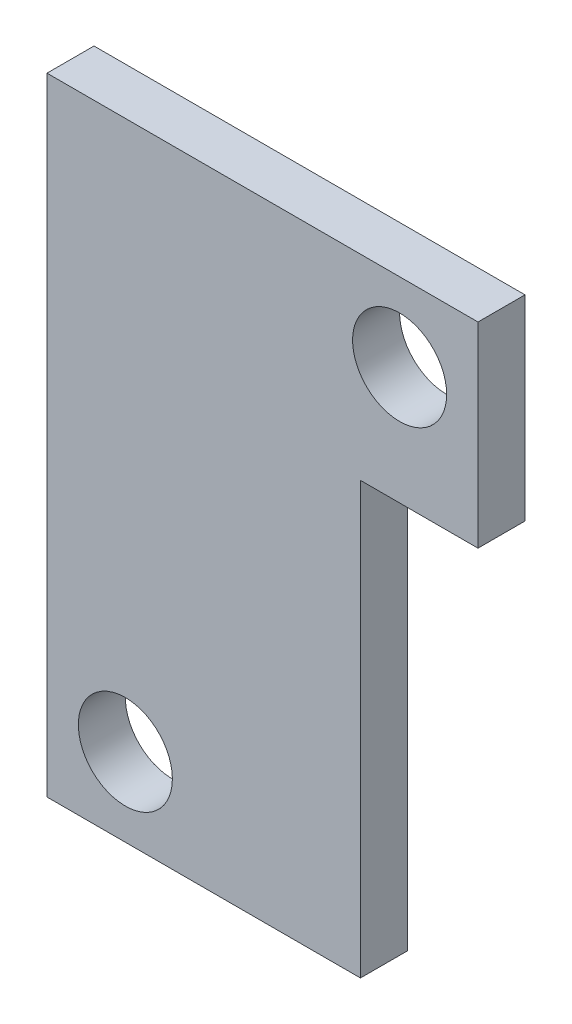
ISO-10303-21;
HEADER;
FILE_DESCRIPTION(('STEP AP214'),'2;1');
FILE_NAME('part.step','',(''),(''),'','','');
FILE_SCHEMA(('AUTOMOTIVE_DESIGN { 1 0 10303 214 1 1 1 1 }'));
ENDSEC;
DATA;
#1=APPLICATION_CONTEXT('core data for automotive mechanical design processes');
#2=APPLICATION_PROTOCOL_DEFINITION('international standard','automotive_design',2000,#1);
#3=PRODUCT_CONTEXT('',#1,'mechanical');
#4=PRODUCT('Part','Part','',(#3));
#5=PRODUCT_RELATED_PRODUCT_CATEGORY('part','',(#4));
#6=PRODUCT_DEFINITION_FORMATION('','',#4);
#7=PRODUCT_DEFINITION_CONTEXT('part definition',#1,'design');
#8=PRODUCT_DEFINITION('design','',#6,#7);
#9=PRODUCT_DEFINITION_SHAPE('','',#8);
#10=(LENGTH_UNIT() NAMED_UNIT(*) SI_UNIT(.MILLI.,.METRE.));
#11=(NAMED_UNIT(*) PLANE_ANGLE_UNIT() SI_UNIT($,.RADIAN.));
#12=(NAMED_UNIT(*) SI_UNIT($,.STERADIAN.) SOLID_ANGLE_UNIT());
#13=UNCERTAINTY_MEASURE_WITH_UNIT(LENGTH_MEASURE(1.E-05),#10,'distance_accuracy_value','');
#14=(GEOMETRIC_REPRESENTATION_CONTEXT(3) GLOBAL_UNCERTAINTY_ASSIGNED_CONTEXT((#13)) GLOBAL_UNIT_ASSIGNED_CONTEXT((#10,
#11,#12)) REPRESENTATION_CONTEXT('',''));
#15=CARTESIAN_POINT('',(0.,0.,0.));
#16=DIRECTION('',(0.,0.,1.));
#17=DIRECTION('',(1.,0.,0.));
#18=AXIS2_PLACEMENT_3D('',#15,#16,#17);
#19=CARTESIAN_POINT('',(0.,0.,1.2));
#20=DIRECTION('',(0.,0.,-1.));
#21=DIRECTION('',(-1.,0.,0.));
#22=AXIS2_PLACEMENT_3D('',#19,#20,#21);
#23=PLANE('',#22);
#24=DIRECTION('',(0.,-1.,0.));
#25=VECTOR('',#24,1.);
#26=CARTESIAN_POINT('',(0.,0.,1.2));
#27=LINE('',#26,#25);
#28=CARTESIAN_POINT('',(0.,16.,1.2));
#29=VERTEX_POINT('',#28);
#30=CARTESIAN_POINT('',(0.,0.,1.2));
#31=VERTEX_POINT('',#30);
#32=EDGE_CURVE('E146',#29,#31,#27,.T.);
#33=ORIENTED_EDGE('',*,*,#32,.T.);
#34=DIRECTION('',(1.,0.,0.));
#35=VECTOR('',#34,1.);
#36=CARTESIAN_POINT('',(0.,0.,1.2));
#37=LINE('',#36,#35);
#38=CARTESIAN_POINT('',(8.,0.,1.2));
#39=VERTEX_POINT('',#38);
#40=EDGE_CURVE('E94',#31,#39,#37,.T.);
#41=ORIENTED_EDGE('',*,*,#40,.T.);
#42=DIRECTION('',(0.,1.,0.));
#43=VECTOR('',#42,1.);
#44=CARTESIAN_POINT('',(8.,0.,1.2));
#45=LINE('',#44,#43);
#46=CARTESIAN_POINT('',(8.,11.,1.2));
#47=VERTEX_POINT('',#46);
#48=EDGE_CURVE('E107',#39,#47,#45,.T.);
#49=ORIENTED_EDGE('',*,*,#48,.T.);
#50=DIRECTION('',(1.,0.,0.));
#51=VECTOR('',#50,1.);
#52=CARTESIAN_POINT('',(8.,11.,1.2));
#53=LINE('',#52,#51);
#54=CARTESIAN_POINT('',(11.,11.,1.2));
#55=VERTEX_POINT('',#54);
#56=EDGE_CURVE('E101',#47,#55,#53,.T.);
#57=ORIENTED_EDGE('',*,*,#56,.T.);
#58=DIRECTION('',(0.,1.,0.));
#59=VECTOR('',#58,1.);
#60=CARTESIAN_POINT('',(11.,11.,1.2));
#61=LINE('',#60,#59);
#62=CARTESIAN_POINT('',(11.,16.,1.2));
#63=VERTEX_POINT('',#62);
#64=EDGE_CURVE('E105',#55,#63,#61,.T.);
#65=ORIENTED_EDGE('',*,*,#64,.T.);
#66=DIRECTION('',(-1.,0.,0.));
#67=VECTOR('',#66,1.);
#68=CARTESIAN_POINT('',(0.,16.,1.2));
#69=LINE('',#68,#67);
#70=EDGE_CURVE('E57',#63,#29,#69,.T.);
#71=ORIENTED_EDGE('',*,*,#70,.T.);
#72=EDGE_LOOP('',(#33,#41,#49,#57,#65,#71));
#73=FACE_BOUND('',#72,.T.);
#74=CARTESIAN_POINT('',(9.,14.,1.2));
#75=DIRECTION('',(0.,0.,1.));
#76=DIRECTION('',(1.,0.,0.));
#77=AXIS2_PLACEMENT_3D('',#74,#75,#76);
#78=CIRCLE('',#77,1.2);
#79=CARTESIAN_POINT('',(10.2,14.,1.2));
#80=VERTEX_POINT('',#79);
#81=EDGE_CURVE('E134',#80,#80,#78,.T.);
#82=ORIENTED_EDGE('',*,*,#81,.F.);
#83=EDGE_LOOP('',(#82));
#84=FACE_BOUND('',#83,.T.);
#85=CARTESIAN_POINT('',(2.,2.,1.2));
#86=DIRECTION('',(0.,0.,1.));
#87=DIRECTION('',(1.,0.,0.));
#88=AXIS2_PLACEMENT_3D('',#85,#86,#87);
#89=CIRCLE('',#88,1.2);
#90=CARTESIAN_POINT('',(3.2,2.,1.2));
#91=VERTEX_POINT('',#90);
#92=EDGE_CURVE('E191',#91,#91,#89,.T.);
#93=ORIENTED_EDGE('',*,*,#92,.F.);
#94=EDGE_LOOP('',(#93));
#95=FACE_BOUND('',#94,.T.);
#96=ADVANCED_FACE('F39',(#73,#84,#95),#23,.F.);
#97=CARTESIAN_POINT('',(0.,0.,0.));
#98=DIRECTION('',(0.,0.,-1.));
#99=DIRECTION('',(-1.,0.,0.));
#100=AXIS2_PLACEMENT_3D('',#97,#98,#99);
#101=PLANE('',#100);
#102=CARTESIAN_POINT('',(9.,14.,0.));
#103=DIRECTION('',(0.,0.,1.));
#104=DIRECTION('',(1.,0.,0.));
#105=AXIS2_PLACEMENT_3D('',#102,#103,#104);
#106=CIRCLE('',#105,1.2);
#107=CARTESIAN_POINT('',(10.2,14.,0.));
#108=VERTEX_POINT('',#107);
#109=EDGE_CURVE('E198',#108,#108,#106,.T.);
#110=ORIENTED_EDGE('',*,*,#109,.T.);
#111=EDGE_LOOP('',(#110));
#112=FACE_BOUND('',#111,.T.);
#113=DIRECTION('',(0.,-1.,0.));
#114=VECTOR('',#113,1.);
#115=CARTESIAN_POINT('',(0.,0.,0.));
#116=LINE('',#115,#114);
#117=CARTESIAN_POINT('',(0.,16.,0.));
#118=VERTEX_POINT('',#117);
#119=CARTESIAN_POINT('',(0.,0.,0.));
#120=VERTEX_POINT('',#119);
#121=EDGE_CURVE('E129',#118,#120,#116,.T.);
#122=ORIENTED_EDGE('',*,*,#121,.F.);
#123=DIRECTION('',(-1.,0.,0.));
#124=VECTOR('',#123,1.);
#125=CARTESIAN_POINT('',(0.,16.,0.));
#126=LINE('',#125,#124);
#127=CARTESIAN_POINT('',(11.,16.,0.));
#128=VERTEX_POINT('',#127);
#129=EDGE_CURVE('E86',#128,#118,#126,.T.);
#130=ORIENTED_EDGE('',*,*,#129,.F.);
#131=DIRECTION('',(0.,1.,0.));
#132=VECTOR('',#131,1.);
#133=CARTESIAN_POINT('',(11.,11.,0.));
#134=LINE('',#133,#132);
#135=CARTESIAN_POINT('',(11.,11.,0.));
#136=VERTEX_POINT('',#135);
#137=EDGE_CURVE('E80',#136,#128,#134,.T.);
#138=ORIENTED_EDGE('',*,*,#137,.F.);
#139=DIRECTION('',(1.,0.,0.));
#140=VECTOR('',#139,1.);
#141=CARTESIAN_POINT('',(8.,11.,0.));
#142=LINE('',#141,#140);
#143=CARTESIAN_POINT('',(8.,11.,0.));
#144=VERTEX_POINT('',#143);
#145=EDGE_CURVE('E116',#144,#136,#142,.T.);
#146=ORIENTED_EDGE('',*,*,#145,.F.);
#147=DIRECTION('',(0.,1.,0.));
#148=VECTOR('',#147,1.);
#149=CARTESIAN_POINT('',(8.,0.,0.));
#150=LINE('',#149,#148);
#151=CARTESIAN_POINT('',(8.,0.,0.));
#152=VERTEX_POINT('',#151);
#153=EDGE_CURVE('E137',#152,#144,#150,.T.);
#154=ORIENTED_EDGE('',*,*,#153,.F.);
#155=DIRECTION('',(1.,0.,0.));
#156=VECTOR('',#155,1.);
#157=CARTESIAN_POINT('',(0.,0.,0.));
#158=LINE('',#157,#156);
#159=EDGE_CURVE('E133',#120,#152,#158,.T.);
#160=ORIENTED_EDGE('',*,*,#159,.F.);
#161=EDGE_LOOP('',(#122,#130,#138,#146,#154,#160));
#162=FACE_BOUND('',#161,.T.);
#163=CARTESIAN_POINT('',(2.,2.,0.));
#164=DIRECTION('',(0.,0.,1.));
#165=DIRECTION('',(1.,0.,0.));
#166=AXIS2_PLACEMENT_3D('',#163,#164,#165);
#167=CIRCLE('',#166,1.2);
#168=CARTESIAN_POINT('',(3.2,2.,0.));
#169=VERTEX_POINT('',#168);
#170=EDGE_CURVE('E194',#169,#169,#167,.T.);
#171=ORIENTED_EDGE('',*,*,#170,.T.);
#172=EDGE_LOOP('',(#171));
#173=FACE_BOUND('',#172,.T.);
#174=ADVANCED_FACE('F159',(#112,#162,#173),#101,.T.);
#175=CARTESIAN_POINT('',(0.,0.,1.2));
#176=DIRECTION('',(1.,0.,0.));
#177=DIRECTION('',(0.,0.,-1.));
#178=AXIS2_PLACEMENT_3D('',#175,#176,#177);
#179=PLANE('',#178);
#180=ORIENTED_EDGE('',*,*,#121,.T.);
#181=DIRECTION('',(0.,0.,-1.));
#182=VECTOR('',#181,1.);
#183=CARTESIAN_POINT('',(0.,0.,1.2));
#184=LINE('',#183,#182);
#185=EDGE_CURVE('E11',#31,#120,#184,.T.);
#186=ORIENTED_EDGE('',*,*,#185,.F.);
#187=ORIENTED_EDGE('',*,*,#32,.F.);
#188=DIRECTION('',(0.,0.,-1.));
#189=VECTOR('',#188,1.);
#190=CARTESIAN_POINT('',(0.,16.,1.2));
#191=LINE('',#190,#189);
#192=EDGE_CURVE('E125',#29,#118,#191,.T.);
#193=ORIENTED_EDGE('',*,*,#192,.T.);
#194=EDGE_LOOP('',(#180,#186,#187,#193));
#195=FACE_BOUND('',#194,.T.);
#196=ADVANCED_FACE('F41',(#195),#179,.F.);
#197=CARTESIAN_POINT('',(0.,0.,1.2));
#198=DIRECTION('',(0.,1.,0.));
#199=DIRECTION('',(0.,0.,1.));
#200=AXIS2_PLACEMENT_3D('',#197,#198,#199);
#201=PLANE('',#200);
#202=ORIENTED_EDGE('',*,*,#159,.T.);
#203=DIRECTION('',(0.,0.,-1.));
#204=VECTOR('',#203,1.);
#205=CARTESIAN_POINT('',(8.,0.,1.2));
#206=LINE('',#205,#204);
#207=EDGE_CURVE('E49',#39,#152,#206,.T.);
#208=ORIENTED_EDGE('',*,*,#207,.F.);
#209=ORIENTED_EDGE('',*,*,#40,.F.);
#210=ORIENTED_EDGE('',*,*,#185,.T.);
#211=EDGE_LOOP('',(#202,#208,#209,#210));
#212=FACE_BOUND('',#211,.T.);
#213=ADVANCED_FACE('F246',(#212),#201,.F.);
#214=CARTESIAN_POINT('',(8.,0.,1.2));
#215=DIRECTION('',(-1.,0.,0.));
#216=DIRECTION('',(0.,0.,1.));
#217=AXIS2_PLACEMENT_3D('',#214,#215,#216);
#218=PLANE('',#217);
#219=ORIENTED_EDGE('',*,*,#153,.T.);
#220=DIRECTION('',(0.,0.,-1.));
#221=VECTOR('',#220,1.);
#222=CARTESIAN_POINT('',(8.,11.,1.2));
#223=LINE('',#222,#221);
#224=EDGE_CURVE('E118',#47,#144,#223,.T.);
#225=ORIENTED_EDGE('',*,*,#224,.F.);
#226=ORIENTED_EDGE('',*,*,#48,.F.);
#227=ORIENTED_EDGE('',*,*,#207,.T.);
#228=EDGE_LOOP('',(#219,#225,#226,#227));
#229=FACE_BOUND('',#228,.T.);
#230=ADVANCED_FACE('F156',(#229),#218,.F.);
#231=CARTESIAN_POINT('',(8.,11.,1.2));
#232=DIRECTION('',(0.,1.,0.));
#233=DIRECTION('',(0.,0.,1.));
#234=AXIS2_PLACEMENT_3D('',#231,#232,#233);
#235=PLANE('',#234);
#236=ORIENTED_EDGE('',*,*,#145,.T.);
#237=DIRECTION('',(0.,0.,-1.));
#238=VECTOR('',#237,1.);
#239=CARTESIAN_POINT('',(11.,11.,1.2));
#240=LINE('',#239,#238);
#241=EDGE_CURVE('E113',#55,#136,#240,.T.);
#242=ORIENTED_EDGE('',*,*,#241,.F.);
#243=ORIENTED_EDGE('',*,*,#56,.F.);
#244=ORIENTED_EDGE('',*,*,#224,.T.);
#245=EDGE_LOOP('',(#236,#242,#243,#244));
#246=FACE_BOUND('',#245,.T.);
#247=ADVANCED_FACE('F114',(#246),#235,.F.);
#248=CARTESIAN_POINT('',(11.,11.,1.2));
#249=DIRECTION('',(-1.,0.,0.));
#250=DIRECTION('',(0.,0.,1.));
#251=AXIS2_PLACEMENT_3D('',#248,#249,#250);
#252=PLANE('',#251);
#253=ORIENTED_EDGE('',*,*,#137,.T.);
#254=DIRECTION('',(0.,0.,-1.));
#255=VECTOR('',#254,1.);
#256=CARTESIAN_POINT('',(11.,16.,1.2));
#257=LINE('',#256,#255);
#258=EDGE_CURVE('E119',#63,#128,#257,.T.);
#259=ORIENTED_EDGE('',*,*,#258,.F.);
#260=ORIENTED_EDGE('',*,*,#64,.F.);
#261=ORIENTED_EDGE('',*,*,#241,.T.);
#262=EDGE_LOOP('',(#253,#259,#260,#261));
#263=FACE_BOUND('',#262,.T.);
#264=ADVANCED_FACE('F121',(#263),#252,.F.);
#265=CARTESIAN_POINT('',(0.,16.,1.2));
#266=DIRECTION('',(0.,-1.,0.));
#267=DIRECTION('',(0.,0.,-1.));
#268=AXIS2_PLACEMENT_3D('',#265,#266,#267);
#269=PLANE('',#268);
#270=ORIENTED_EDGE('',*,*,#129,.T.);
#271=ORIENTED_EDGE('',*,*,#192,.F.);
#272=ORIENTED_EDGE('',*,*,#70,.F.);
#273=ORIENTED_EDGE('',*,*,#258,.T.);
#274=EDGE_LOOP('',(#270,#271,#272,#273));
#275=FACE_BOUND('',#274,.T.);
#276=ADVANCED_FACE('F164',(#275),#269,.F.);
#277=CARTESIAN_POINT('',(9.,14.,1.2));
#278=DIRECTION('',(0.,0.,-1.));
#279=DIRECTION('',(-1.,0.,0.));
#280=AXIS2_PLACEMENT_3D('',#277,#278,#279);
#281=CYLINDRICAL_SURFACE('',#280,1.2);
#282=ORIENTED_EDGE('',*,*,#81,.T.);
#283=EDGE_LOOP('',(#282));
#284=FACE_BOUND('',#283,.T.);
#285=ORIENTED_EDGE('',*,*,#109,.F.);
#286=EDGE_LOOP('',(#285));
#287=FACE_BOUND('',#286,.T.);
#288=ADVANCED_FACE('F166',(#284,#287),#281,.F.);
#289=CARTESIAN_POINT('',(2.,2.,1.2));
#290=DIRECTION('',(0.,0.,-1.));
#291=DIRECTION('',(-1.,0.,0.));
#292=AXIS2_PLACEMENT_3D('',#289,#290,#291);
#293=CYLINDRICAL_SURFACE('',#292,1.2);
#294=ORIENTED_EDGE('',*,*,#92,.T.);
#295=EDGE_LOOP('',(#294));
#296=FACE_BOUND('',#295,.T.);
#297=ORIENTED_EDGE('',*,*,#170,.F.);
#298=EDGE_LOOP('',(#297));
#299=FACE_BOUND('',#298,.T.);
#300=ADVANCED_FACE('F172',(#296,#299),#293,.F.);
#301=CLOSED_SHELL('',(#96,#174,#196,#213,#230,#247,#264,#276,#288,#300));
#302=MANIFOLD_SOLID_BREP('B2',#301);
#303=ADVANCED_BREP_SHAPE_REPRESENTATION('',(#18,#302),#14);
#304=SHAPE_DEFINITION_REPRESENTATION(#9,#303);
ENDSEC;
END-ISO-10303-21;
